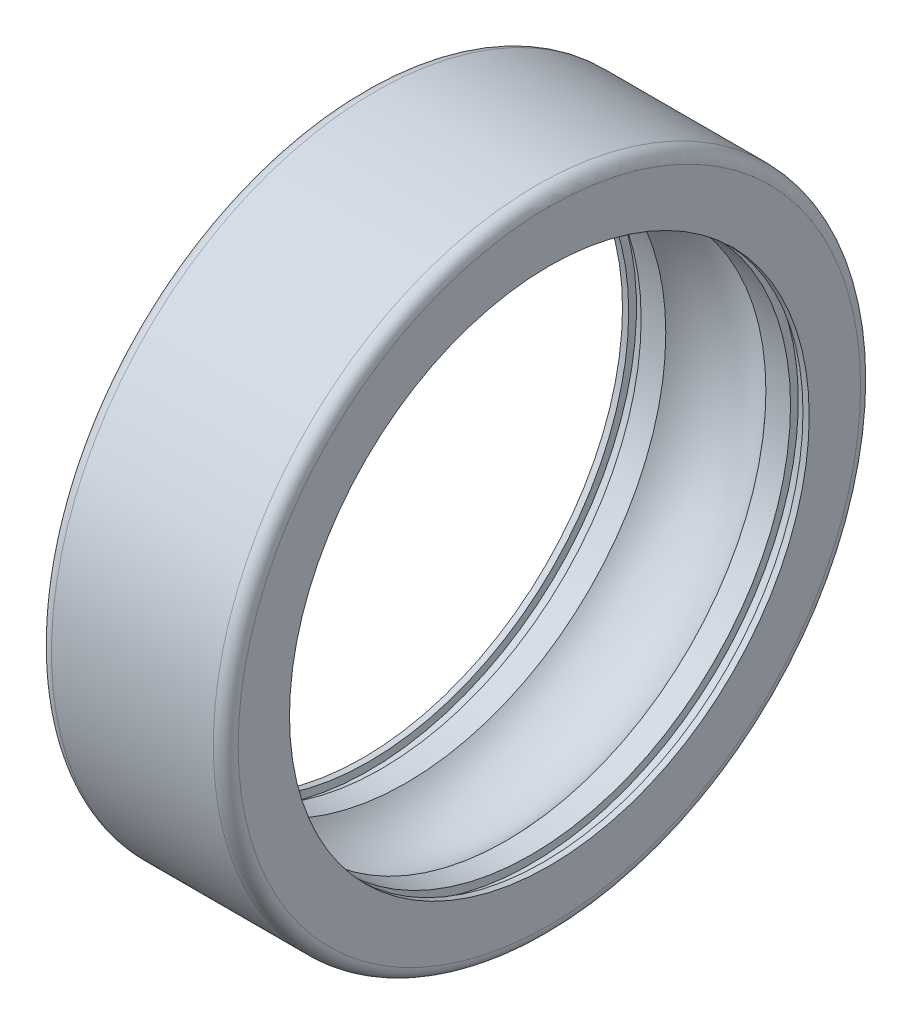
ISO-10303-21;
HEADER;
FILE_DESCRIPTION(('STEP AP214'),'2;1');
FILE_NAME('part.step','',(''),(''),'','','');
FILE_SCHEMA(('AUTOMOTIVE_DESIGN { 1 0 10303 214 1 1 1 1 }'));
ENDSEC;
DATA;
#1=APPLICATION_CONTEXT('core data for automotive mechanical design processes');
#2=APPLICATION_PROTOCOL_DEFINITION('international standard','automotive_design',2000,#1);
#3=PRODUCT_CONTEXT('',#1,'mechanical');
#4=PRODUCT('Part','Part','',(#3));
#5=PRODUCT_RELATED_PRODUCT_CATEGORY('part','',(#4));
#6=PRODUCT_DEFINITION_FORMATION('','',#4);
#7=PRODUCT_DEFINITION_CONTEXT('part definition',#1,'design');
#8=PRODUCT_DEFINITION('design','',#6,#7);
#9=PRODUCT_DEFINITION_SHAPE('','',#8);
#10=(LENGTH_UNIT() NAMED_UNIT(*) SI_UNIT(.MILLI.,.METRE.));
#11=(NAMED_UNIT(*) PLANE_ANGLE_UNIT() SI_UNIT($,.RADIAN.));
#12=(NAMED_UNIT(*) SI_UNIT($,.STERADIAN.) SOLID_ANGLE_UNIT());
#13=UNCERTAINTY_MEASURE_WITH_UNIT(LENGTH_MEASURE(1.E-05),#10,'distance_accuracy_value','');
#14=(GEOMETRIC_REPRESENTATION_CONTEXT(3) GLOBAL_UNCERTAINTY_ASSIGNED_CONTEXT((#13)) GLOBAL_UNIT_ASSIGNED_CONTEXT((#10,
#11,#12)) REPRESENTATION_CONTEXT('',''));
#15=CARTESIAN_POINT('',(0.,0.,0.));
#16=DIRECTION('',(0.,0.,1.));
#17=DIRECTION('',(1.,0.,0.));
#18=AXIS2_PLACEMENT_3D('',#15,#16,#17);
#19=CARTESIAN_POINT('',(7.5,0.,0.));
#20=DIRECTION('',(-1.,0.,0.));
#21=DIRECTION('',(0.,0.,1.));
#22=AXIS2_PLACEMENT_3D('',#19,#20,#21);
#23=CYLINDRICAL_SURFACE('',#22,20.875);
#24=CARTESIAN_POINT('',(-7.5,0.,0.));
#25=DIRECTION('',(1.,0.,0.));
#26=DIRECTION('',(0.,0.,-1.));
#27=AXIS2_PLACEMENT_3D('',#24,#25,#26);
#28=CIRCLE('',#27,20.875);
#29=CARTESIAN_POINT('',(-7.5,0.,-20.875));
#30=VERTEX_POINT('',#29);
#31=EDGE_CURVE('E70',#30,#30,#28,.T.);
#32=ORIENTED_EDGE('',*,*,#31,.F.);
#33=EDGE_LOOP('',(#32));
#34=FACE_BOUND('',#33,.T.);
#35=CARTESIAN_POINT('',(-7.,0.,0.));
#36=DIRECTION('',(-1.,0.,0.));
#37=DIRECTION('',(0.,0.,1.));
#38=AXIS2_PLACEMENT_3D('',#35,#36,#37);
#39=CIRCLE('',#38,20.875);
#40=CARTESIAN_POINT('',(-7.,0.,20.875));
#41=VERTEX_POINT('',#40);
#42=EDGE_CURVE('E86',#41,#41,#39,.T.);
#43=ORIENTED_EDGE('',*,*,#42,.F.);
#44=EDGE_LOOP('',(#43));
#45=FACE_BOUND('',#44,.T.);
#46=ADVANCED_FACE('F41',(#34,#45),#23,.F.);
#47=CARTESIAN_POINT('',(7.5,0.,0.));
#48=DIRECTION('',(1.,0.,0.));
#49=DIRECTION('',(0.,0.,-1.));
#50=AXIS2_PLACEMENT_3D('',#47,#48,#49);
#51=CIRCLE('',#50,20.875);
#52=CARTESIAN_POINT('',(7.5,0.,-20.875));
#53=VERTEX_POINT('',#52);
#54=EDGE_CURVE('E65',#53,#53,#51,.T.);
#55=ORIENTED_EDGE('',*,*,#54,.T.);
#56=EDGE_LOOP('',(#55));
#57=FACE_BOUND('',#56,.T.);
#58=CARTESIAN_POINT('',(7.,0.,0.));
#59=DIRECTION('',(-1.,0.,0.));
#60=DIRECTION('',(0.,0.,1.));
#61=AXIS2_PLACEMENT_3D('',#58,#59,#60);
#62=CIRCLE('',#61,20.875);
#63=CARTESIAN_POINT('',(7.,0.,20.875));
#64=VERTEX_POINT('',#63);
#65=EDGE_CURVE('E95',#64,#64,#62,.T.);
#66=ORIENTED_EDGE('',*,*,#65,.T.);
#67=EDGE_LOOP('',(#66));
#68=FACE_BOUND('',#67,.T.);
#69=ADVANCED_FACE('F118',(#57,#68),#23,.F.);
#70=CARTESIAN_POINT('',(7.5,0.,0.));
#71=DIRECTION('',(1.,0.,0.));
#72=DIRECTION('',(0.,0.,-1.));
#73=AXIS2_PLACEMENT_3D('',#70,#71,#72);
#74=PLANE('',#73);
#75=CARTESIAN_POINT('',(7.5,0.,0.));
#76=DIRECTION('',(1.,0.,0.));
#77=DIRECTION('',(0.,0.,-1.));
#78=AXIS2_PLACEMENT_3D('',#75,#76,#77);
#79=CIRCLE('',#78,25.);
#80=CARTESIAN_POINT('',(7.5,0.,-25.));
#81=VERTEX_POINT('',#80);
#82=EDGE_CURVE('E10',#81,#81,#79,.T.);
#83=ORIENTED_EDGE('',*,*,#82,.T.);
#84=EDGE_LOOP('',(#83));
#85=FACE_BOUND('',#84,.T.);
#86=ORIENTED_EDGE('',*,*,#54,.F.);
#87=EDGE_LOOP('',(#86));
#88=FACE_BOUND('',#87,.T.);
#89=ADVANCED_FACE('F125',(#85,#88),#74,.T.);
#90=CARTESIAN_POINT('',(-7.5,0.,0.));
#91=DIRECTION('',(1.,0.,0.));
#92=DIRECTION('',(0.,0.,-1.));
#93=AXIS2_PLACEMENT_3D('',#90,#91,#92);
#94=PLANE('',#93);
#95=CARTESIAN_POINT('',(-7.5,0.,0.));
#96=DIRECTION('',(1.,0.,0.));
#97=DIRECTION('',(0.,0.,-1.));
#98=AXIS2_PLACEMENT_3D('',#95,#96,#97);
#99=CIRCLE('',#98,25.);
#100=CARTESIAN_POINT('',(-7.5,0.,-25.));
#101=VERTEX_POINT('',#100);
#102=EDGE_CURVE('E49',#101,#101,#99,.F.);
#103=ORIENTED_EDGE('',*,*,#102,.T.);
#104=EDGE_LOOP('',(#103));
#105=FACE_BOUND('',#104,.T.);
#106=ORIENTED_EDGE('',*,*,#31,.T.);
#107=EDGE_LOOP('',(#106));
#108=FACE_BOUND('',#107,.T.);
#109=ADVANCED_FACE('F195',(#105,#108),#94,.F.);
#110=CARTESIAN_POINT('',(7.5,0.,0.));
#111=DIRECTION('',(-1.,0.,0.));
#112=DIRECTION('',(0.,0.,1.));
#113=AXIS2_PLACEMENT_3D('',#110,#111,#112);
#114=CYLINDRICAL_SURFACE('',#113,26.);
#115=CARTESIAN_POINT('',(-6.5,0.,0.));
#116=DIRECTION('',(1.,0.,0.));
#117=DIRECTION('',(0.,0.,-1.));
#118=AXIS2_PLACEMENT_3D('',#115,#116,#117);
#119=CIRCLE('',#118,26.);
#120=CARTESIAN_POINT('',(-6.5,0.,-26.));
#121=VERTEX_POINT('',#120);
#122=EDGE_CURVE('E54',#121,#121,#119,.T.);
#123=ORIENTED_EDGE('',*,*,#122,.T.);
#124=EDGE_LOOP('',(#123));
#125=FACE_BOUND('',#124,.T.);
#126=CARTESIAN_POINT('',(6.5,0.,0.));
#127=DIRECTION('',(1.,0.,0.));
#128=DIRECTION('',(0.,0.,-1.));
#129=AXIS2_PLACEMENT_3D('',#126,#127,#128);
#130=CIRCLE('',#129,26.);
#131=CARTESIAN_POINT('',(6.5,0.,-26.));
#132=VERTEX_POINT('',#131);
#133=EDGE_CURVE('E59',#132,#132,#130,.F.);
#134=ORIENTED_EDGE('',*,*,#133,.T.);
#135=EDGE_LOOP('',(#134));
#136=FACE_BOUND('',#135,.T.);
#137=ADVANCED_FACE('F158',(#125,#136),#114,.T.);
#138=CARTESIAN_POINT('',(6.,20.875,0.));
#139=DIRECTION('',(1.,0.,0.));
#140=DIRECTION('',(0.,0.,-1.));
#141=AXIS2_PLACEMENT_3D('',#138,#139,#140);
#142=PLANE('',#141);
#143=CARTESIAN_POINT('',(6.,0.,0.));
#144=DIRECTION('',(-1.,0.,0.));
#145=DIRECTION('',(0.,0.,1.));
#146=AXIS2_PLACEMENT_3D('',#143,#144,#145);
#147=CIRCLE('',#146,20.875);
#148=CARTESIAN_POINT('',(6.,0.,20.875));
#149=VERTEX_POINT('',#148);
#150=EDGE_CURVE('E82',#149,#149,#147,.T.);
#151=ORIENTED_EDGE('',*,*,#150,.T.);
#152=EDGE_LOOP('',(#151));
#153=FACE_BOUND('',#152,.T.);
#154=CARTESIAN_POINT('',(6.,0.,0.));
#155=DIRECTION('',(-1.,0.,0.));
#156=DIRECTION('',(0.,0.,1.));
#157=AXIS2_PLACEMENT_3D('',#154,#155,#156);
#158=CIRCLE('',#157,21.5);
#159=CARTESIAN_POINT('',(6.,0.,21.5));
#160=VERTEX_POINT('',#159);
#161=EDGE_CURVE('E87',#160,#160,#158,.T.);
#162=ORIENTED_EDGE('',*,*,#161,.F.);
#163=EDGE_LOOP('',(#162));
#164=FACE_BOUND('',#163,.T.);
#165=ADVANCED_FACE('F155',(#153,#164),#142,.T.);
#166=CARTESIAN_POINT('',(0.,0.,0.));
#167=DIRECTION('',(-1.,0.,0.));
#168=DIRECTION('',(0.,0.,1.));
#169=AXIS2_PLACEMENT_3D('',#166,#167,#168);
#170=CYLINDRICAL_SURFACE('',#169,21.5);
#171=ORIENTED_EDGE('',*,*,#161,.T.);
#172=EDGE_LOOP('',(#171));
#173=FACE_BOUND('',#172,.T.);
#174=CARTESIAN_POINT('',(7.,0.,0.));
#175=DIRECTION('',(-1.,0.,0.));
#176=DIRECTION('',(0.,0.,1.));
#177=AXIS2_PLACEMENT_3D('',#174,#175,#176);
#178=CIRCLE('',#177,21.5);
#179=CARTESIAN_POINT('',(7.,0.,21.5));
#180=VERTEX_POINT('',#179);
#181=EDGE_CURVE('E91',#180,#180,#178,.T.);
#182=ORIENTED_EDGE('',*,*,#181,.F.);
#183=EDGE_LOOP('',(#182));
#184=FACE_BOUND('',#183,.T.);
#185=ADVANCED_FACE('F140',(#173,#184),#170,.F.);
#186=CARTESIAN_POINT('',(7.,20.875,0.));
#187=DIRECTION('',(-1.,0.,0.));
#188=DIRECTION('',(0.,0.,1.));
#189=AXIS2_PLACEMENT_3D('',#186,#187,#188);
#190=PLANE('',#189);
#191=ORIENTED_EDGE('',*,*,#181,.T.);
#192=EDGE_LOOP('',(#191));
#193=FACE_BOUND('',#192,.T.);
#194=ORIENTED_EDGE('',*,*,#65,.F.);
#195=EDGE_LOOP('',(#194));
#196=FACE_BOUND('',#195,.T.);
#197=ADVANCED_FACE('F133',(#193,#196),#190,.T.);
#198=CARTESIAN_POINT('',(-4.02142698553635,0.,0.));
#199=DIRECTION('',(1.,0.,0.));
#200=DIRECTION('',(0.,0.,-1.));
#201=AXIS2_PLACEMENT_3D('',#198,#199,#200);
#202=CIRCLE('',#201,20.875);
#203=CARTESIAN_POINT('',(-4.02142698553635,0.,-20.875));
#204=VERTEX_POINT('',#203);
#205=EDGE_CURVE('E66',#204,#204,#202,.T.);
#206=ORIENTED_EDGE('',*,*,#205,.T.);
#207=EDGE_LOOP('',(#206));
#208=FACE_BOUND('',#207,.T.);
#209=CARTESIAN_POINT('',(-6.,0.,0.));
#210=DIRECTION('',(-1.,0.,0.));
#211=DIRECTION('',(0.,0.,1.));
#212=AXIS2_PLACEMENT_3D('',#209,#210,#211);
#213=CIRCLE('',#212,20.875);
#214=CARTESIAN_POINT('',(-6.,0.,20.875));
#215=VERTEX_POINT('',#214);
#216=EDGE_CURVE('E106',#215,#215,#213,.T.);
#217=ORIENTED_EDGE('',*,*,#216,.T.);
#218=EDGE_LOOP('',(#217));
#219=FACE_BOUND('',#218,.T.);
#220=ADVANCED_FACE('F121',(#208,#219),#23,.F.);
#221=CARTESIAN_POINT('',(0.,0.,0.));
#222=DIRECTION('',(-1.,0.,0.));
#223=DIRECTION('',(0.,0.,1.));
#224=AXIS2_PLACEMENT_3D('',#221,#222,#223);
#225=TOROIDAL_SURFACE('',#224,17.5,5.25);
#226=ORIENTED_EDGE('',*,*,#205,.F.);
#227=EDGE_LOOP('',(#226));
#228=FACE_BOUND('',#227,.T.);
#229=CARTESIAN_POINT('',(4.02142698553635,0.,0.));
#230=DIRECTION('',(-1.,0.,0.));
#231=DIRECTION('',(0.,0.,1.));
#232=AXIS2_PLACEMENT_3D('',#229,#230,#231);
#233=CIRCLE('',#232,20.875);
#234=CARTESIAN_POINT('',(4.02142698553635,0.,20.875));
#235=VERTEX_POINT('',#234);
#236=EDGE_CURVE('E71',#235,#235,#233,.T.);
#237=ORIENTED_EDGE('',*,*,#236,.F.);
#238=EDGE_LOOP('',(#237));
#239=FACE_BOUND('',#238,.T.);
#240=ADVANCED_FACE('F132',(#228,#239),#225,.F.);
#241=ORIENTED_EDGE('',*,*,#236,.T.);
#242=EDGE_LOOP('',(#241));
#243=FACE_BOUND('',#242,.T.);
#244=ORIENTED_EDGE('',*,*,#150,.F.);
#245=EDGE_LOOP('',(#244));
#246=FACE_BOUND('',#245,.T.);
#247=ADVANCED_FACE('F127',(#243,#246),#23,.F.);
#248=CARTESIAN_POINT('',(-7.,20.875,0.));
#249=DIRECTION('',(1.,0.,0.));
#250=DIRECTION('',(0.,0.,-1.));
#251=AXIS2_PLACEMENT_3D('',#248,#249,#250);
#252=PLANE('',#251);
#253=ORIENTED_EDGE('',*,*,#42,.T.);
#254=EDGE_LOOP('',(#253));
#255=FACE_BOUND('',#254,.T.);
#256=CARTESIAN_POINT('',(-7.,0.,0.));
#257=DIRECTION('',(-1.,0.,0.));
#258=DIRECTION('',(0.,0.,1.));
#259=AXIS2_PLACEMENT_3D('',#256,#257,#258);
#260=CIRCLE('',#259,21.5);
#261=CARTESIAN_POINT('',(-7.,0.,21.5));
#262=VERTEX_POINT('',#261);
#263=EDGE_CURVE('E75',#262,#262,#260,.T.);
#264=ORIENTED_EDGE('',*,*,#263,.F.);
#265=EDGE_LOOP('',(#264));
#266=FACE_BOUND('',#265,.T.);
#267=ADVANCED_FACE('F114',(#255,#266),#252,.T.);
#268=CARTESIAN_POINT('',(0.,0.,0.));
#269=DIRECTION('',(-1.,0.,0.));
#270=DIRECTION('',(0.,0.,1.));
#271=AXIS2_PLACEMENT_3D('',#268,#269,#270);
#272=CYLINDRICAL_SURFACE('',#271,21.5);
#273=ORIENTED_EDGE('',*,*,#263,.T.);
#274=EDGE_LOOP('',(#273));
#275=FACE_BOUND('',#274,.T.);
#276=CARTESIAN_POINT('',(-6.,0.,0.));
#277=DIRECTION('',(-1.,0.,0.));
#278=DIRECTION('',(0.,0.,1.));
#279=AXIS2_PLACEMENT_3D('',#276,#277,#278);
#280=CIRCLE('',#279,21.5);
#281=CARTESIAN_POINT('',(-6.,0.,21.5));
#282=VERTEX_POINT('',#281);
#283=EDGE_CURVE('E102',#282,#282,#280,.T.);
#284=ORIENTED_EDGE('',*,*,#283,.F.);
#285=EDGE_LOOP('',(#284));
#286=FACE_BOUND('',#285,.T.);
#287=ADVANCED_FACE('F149',(#275,#286),#272,.F.);
#288=CARTESIAN_POINT('',(-6.,20.875,0.));
#289=DIRECTION('',(-1.,0.,0.));
#290=DIRECTION('',(0.,0.,1.));
#291=AXIS2_PLACEMENT_3D('',#288,#289,#290);
#292=PLANE('',#291);
#293=ORIENTED_EDGE('',*,*,#283,.T.);
#294=EDGE_LOOP('',(#293));
#295=FACE_BOUND('',#294,.T.);
#296=ORIENTED_EDGE('',*,*,#216,.F.);
#297=EDGE_LOOP('',(#296));
#298=FACE_BOUND('',#297,.T.);
#299=ADVANCED_FACE('F174',(#295,#298),#292,.T.);
#300=CARTESIAN_POINT('',(-6.5,0.,0.));
#301=DIRECTION('',(1.,0.,0.));
#302=DIRECTION('',(0.,0.,-1.));
#303=AXIS2_PLACEMENT_3D('',#300,#301,#302);
#304=TOROIDAL_SURFACE('',#303,25.,1.);
#305=ORIENTED_EDGE('',*,*,#102,.F.);
#306=EDGE_LOOP('',(#305));
#307=FACE_BOUND('',#306,.T.);
#308=ORIENTED_EDGE('',*,*,#122,.F.);
#309=EDGE_LOOP('',(#308));
#310=FACE_BOUND('',#309,.T.);
#311=ADVANCED_FACE('F177',(#307,#310),#304,.T.);
#312=CARTESIAN_POINT('',(6.5,0.,0.));
#313=DIRECTION('',(1.,0.,0.));
#314=DIRECTION('',(0.,0.,-1.));
#315=AXIS2_PLACEMENT_3D('',#312,#313,#314);
#316=TOROIDAL_SURFACE('',#315,25.,1.);
#317=ORIENTED_EDGE('',*,*,#133,.F.);
#318=EDGE_LOOP('',(#317));
#319=FACE_BOUND('',#318,.T.);
#320=ORIENTED_EDGE('',*,*,#82,.F.);
#321=EDGE_LOOP('',(#320));
#322=FACE_BOUND('',#321,.T.);
#323=ADVANCED_FACE('F43',(#319,#322),#316,.T.);
#324=CLOSED_SHELL('',(#46,#69,#89,#109,#137,#165,#185,#197,#220,#240,#247,#267,#287,#299,#311,#323));
#325=MANIFOLD_SOLID_BREP('B2',#324);
#326=ADVANCED_BREP_SHAPE_REPRESENTATION('',(#18,#325),#14);
#327=SHAPE_DEFINITION_REPRESENTATION(#9,#326);
ENDSEC;
END-ISO-10303-21;
